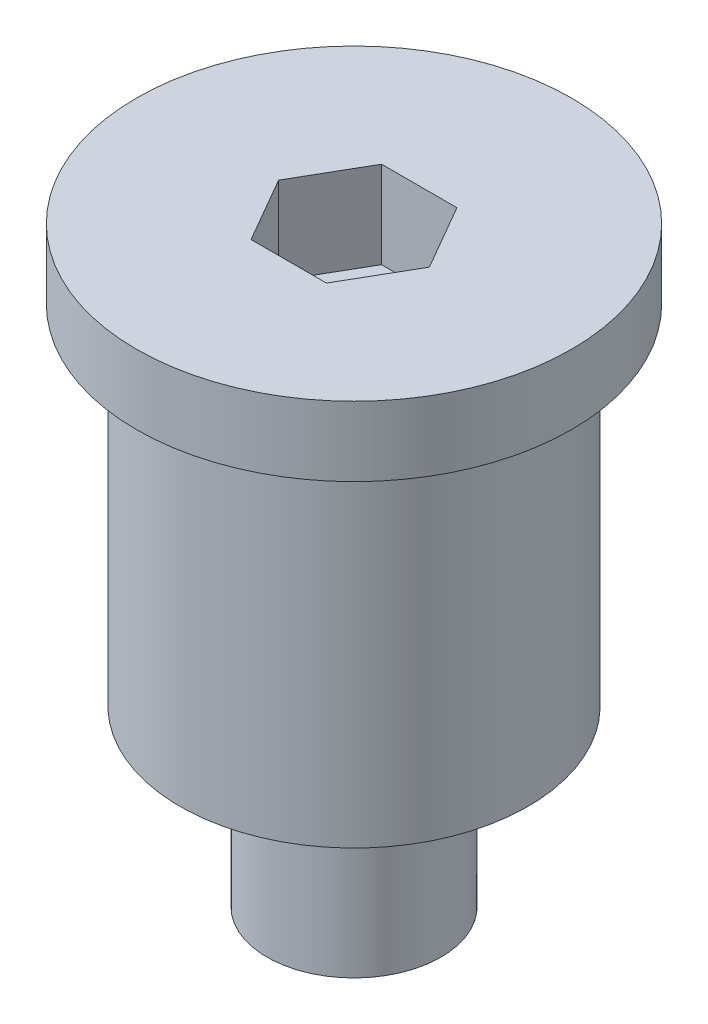
ISO-10303-21;
HEADER;
FILE_DESCRIPTION(('STEP AP214'),'2;1');
FILE_NAME('part.step','',(''),(''),'','','');
FILE_SCHEMA(('AUTOMOTIVE_DESIGN { 1 0 10303 214 1 1 1 1 }'));
ENDSEC;
DATA;
#1=APPLICATION_CONTEXT('core data for automotive mechanical design processes');
#2=APPLICATION_PROTOCOL_DEFINITION('international standard','automotive_design',2000,#1);
#3=PRODUCT_CONTEXT('',#1,'mechanical');
#4=PRODUCT('Part','Part','',(#3));
#5=PRODUCT_RELATED_PRODUCT_CATEGORY('part','',(#4));
#6=PRODUCT_DEFINITION_FORMATION('','',#4);
#7=PRODUCT_DEFINITION_CONTEXT('part definition',#1,'design');
#8=PRODUCT_DEFINITION('design','',#6,#7);
#9=PRODUCT_DEFINITION_SHAPE('','',#8);
#10=(LENGTH_UNIT() NAMED_UNIT(*) SI_UNIT(.MILLI.,.METRE.));
#11=(NAMED_UNIT(*) PLANE_ANGLE_UNIT() SI_UNIT($,.RADIAN.));
#12=(NAMED_UNIT(*) SI_UNIT($,.STERADIAN.) SOLID_ANGLE_UNIT());
#13=UNCERTAINTY_MEASURE_WITH_UNIT(LENGTH_MEASURE(1.E-05),#10,'distance_accuracy_value','');
#14=(GEOMETRIC_REPRESENTATION_CONTEXT(3) GLOBAL_UNCERTAINTY_ASSIGNED_CONTEXT((#13)) GLOBAL_UNIT_ASSIGNED_CONTEXT((#10,
#11,#12)) REPRESENTATION_CONTEXT('',''));
#15=CARTESIAN_POINT('',(0.,0.,0.));
#16=DIRECTION('',(0.,0.,1.));
#17=DIRECTION('',(1.,0.,0.));
#18=AXIS2_PLACEMENT_3D('',#15,#16,#17);
#19=CARTESIAN_POINT('',(0.,0.,3.175));
#20=DIRECTION('',(0.,1.,0.));
#21=DIRECTION('',(0.,0.,1.));
#22=AXIS2_PLACEMENT_3D('',#19,#20,#21);
#23=PLANE('',#22);
#24=CARTESIAN_POINT('',(0.,0.,0.));
#25=DIRECTION('',(0.,-1.,0.));
#26=DIRECTION('',(0.,0.,-1.));
#27=AXIS2_PLACEMENT_3D('',#24,#25,#26);
#28=CIRCLE('',#27,3.175);
#29=CARTESIAN_POINT('',(0.,0.,-3.175));
#30=VERTEX_POINT('',#29);
#31=EDGE_CURVE('E136',#30,#30,#28,.T.);
#32=ORIENTED_EDGE('',*,*,#31,.T.);
#33=EDGE_LOOP('',(#32));
#34=FACE_BOUND('',#33,.T.);
#35=ADVANCED_FACE('F35',(#34),#23,.F.);
#36=CARTESIAN_POINT('',(0.,21.59,0.));
#37=DIRECTION('',(0.,-1.,0.));
#38=DIRECTION('',(0.,0.,-1.));
#39=AXIS2_PLACEMENT_3D('',#36,#37,#38);
#40=PLANE('',#39);
#41=DIRECTION('',(-0.5,0.,0.866025403784439));
#42=VECTOR('',#41,1.);
#43=CARTESIAN_POINT('',(-1.3748153285078,21.59,-2.38125));
#44=LINE('',#43,#42);
#45=CARTESIAN_POINT('',(-1.3748153285078,21.59,-2.38125));
#46=VERTEX_POINT('',#45);
#47=CARTESIAN_POINT('',(-2.74963065701559,21.59,0.));
#48=VERTEX_POINT('',#47);
#49=EDGE_CURVE('E123',#46,#48,#44,.T.);
#50=ORIENTED_EDGE('',*,*,#49,.F.);
#51=DIRECTION('',(-1.,0.,0.));
#52=VECTOR('',#51,1.);
#53=CARTESIAN_POINT('',(1.3748153285078,21.59,-2.38125));
#54=LINE('',#53,#52);
#55=CARTESIAN_POINT('',(1.3748153285078,21.59,-2.38125));
#56=VERTEX_POINT('',#55);
#57=EDGE_CURVE('E49',#56,#46,#54,.T.);
#58=ORIENTED_EDGE('',*,*,#57,.F.);
#59=DIRECTION('',(-0.5,0.,-0.866025403784439));
#60=VECTOR('',#59,1.);
#61=CARTESIAN_POINT('',(2.74963065701559,21.59,0.));
#62=LINE('',#61,#60);
#63=CARTESIAN_POINT('',(2.74963065701559,21.59,0.));
#64=VERTEX_POINT('',#63);
#65=EDGE_CURVE('E132',#64,#56,#62,.T.);
#66=ORIENTED_EDGE('',*,*,#65,.F.);
#67=DIRECTION('',(0.5,0.,-0.866025403784439));
#68=VECTOR('',#67,1.);
#69=CARTESIAN_POINT('',(1.3748153285078,21.59,2.38125));
#70=LINE('',#69,#68);
#71=CARTESIAN_POINT('',(1.3748153285078,21.59,2.38125));
#72=VERTEX_POINT('',#71);
#73=EDGE_CURVE('E130',#72,#64,#70,.T.);
#74=ORIENTED_EDGE('',*,*,#73,.F.);
#75=DIRECTION('',(1.,0.,0.));
#76=VECTOR('',#75,1.);
#77=CARTESIAN_POINT('',(-1.3748153285078,21.59,2.38125));
#78=LINE('',#77,#76);
#79=CARTESIAN_POINT('',(-1.3748153285078,21.59,2.38125));
#80=VERTEX_POINT('',#79);
#81=EDGE_CURVE('E97',#80,#72,#78,.T.);
#82=ORIENTED_EDGE('',*,*,#81,.F.);
#83=DIRECTION('',(0.5,0.,0.866025403784439));
#84=VECTOR('',#83,1.);
#85=CARTESIAN_POINT('',(-2.74963065701559,21.59,0.));
#86=LINE('',#85,#84);
#87=EDGE_CURVE('E126',#48,#80,#86,.T.);
#88=ORIENTED_EDGE('',*,*,#87,.F.);
#89=EDGE_LOOP('',(#50,#58,#66,#74,#82,#88));
#90=FACE_BOUND('',#89,.T.);
#91=CARTESIAN_POINT('',(0.,21.59,0.));
#92=DIRECTION('',(0.,-1.,0.));
#93=DIRECTION('',(0.,0.,-1.));
#94=AXIS2_PLACEMENT_3D('',#91,#92,#93);
#95=CIRCLE('',#94,7.9375);
#96=CARTESIAN_POINT('',(0.,21.59,-7.9375));
#97=VERTEX_POINT('',#96);
#98=EDGE_CURVE('E11',#97,#97,#95,.T.);
#99=ORIENTED_EDGE('',*,*,#98,.F.);
#100=EDGE_LOOP('',(#99));
#101=FACE_BOUND('',#100,.T.);
#102=ADVANCED_FACE('F160',(#90,#101),#40,.F.);
#103=CARTESIAN_POINT('',(0.,0.,0.));
#104=DIRECTION('',(0.,-1.,0.));
#105=DIRECTION('',(0.,0.,-1.));
#106=AXIS2_PLACEMENT_3D('',#103,#104,#105);
#107=CYLINDRICAL_SURFACE('',#106,7.9375);
#108=CARTESIAN_POINT('',(0.,19.05,0.));
#109=DIRECTION('',(0.,-1.,0.));
#110=DIRECTION('',(0.,0.,-1.));
#111=AXIS2_PLACEMENT_3D('',#108,#109,#110);
#112=CIRCLE('',#111,7.9375);
#113=CARTESIAN_POINT('',(0.,19.05,-7.9375));
#114=VERTEX_POINT('',#113);
#115=EDGE_CURVE('E42',#114,#114,#112,.T.);
#116=ORIENTED_EDGE('',*,*,#115,.F.);
#117=EDGE_LOOP('',(#116));
#118=FACE_BOUND('',#117,.T.);
#119=ORIENTED_EDGE('',*,*,#98,.T.);
#120=EDGE_LOOP('',(#119));
#121=FACE_BOUND('',#120,.T.);
#122=ADVANCED_FACE('F157',(#118,#121),#107,.T.);
#123=CARTESIAN_POINT('',(0.,19.05,7.9375));
#124=DIRECTION('',(0.,1.,0.));
#125=DIRECTION('',(0.,0.,1.));
#126=AXIS2_PLACEMENT_3D('',#123,#124,#125);
#127=PLANE('',#126);
#128=CARTESIAN_POINT('',(0.,19.05,0.));
#129=DIRECTION('',(0.,-1.,0.));
#130=DIRECTION('',(0.,0.,-1.));
#131=AXIS2_PLACEMENT_3D('',#128,#129,#130);
#132=CIRCLE('',#131,6.35);
#133=CARTESIAN_POINT('',(0.,19.05,-6.35));
#134=VERTEX_POINT('',#133);
#135=EDGE_CURVE('E150',#134,#134,#132,.T.);
#136=ORIENTED_EDGE('',*,*,#135,.F.);
#137=EDGE_LOOP('',(#136));
#138=FACE_BOUND('',#137,.T.);
#139=ORIENTED_EDGE('',*,*,#115,.T.);
#140=EDGE_LOOP('',(#139));
#141=FACE_BOUND('',#140,.T.);
#142=ADVANCED_FACE('F155',(#138,#141),#127,.F.);
#143=CARTESIAN_POINT('',(0.,0.,0.));
#144=DIRECTION('',(0.,-1.,0.));
#145=DIRECTION('',(0.,0.,-1.));
#146=AXIS2_PLACEMENT_3D('',#143,#144,#145);
#147=CYLINDRICAL_SURFACE('',#146,6.35);
#148=CARTESIAN_POINT('',(0.,6.35,0.));
#149=DIRECTION('',(0.,-1.,0.));
#150=DIRECTION('',(0.,0.,-1.));
#151=AXIS2_PLACEMENT_3D('',#148,#149,#150);
#152=CIRCLE('',#151,6.35);
#153=CARTESIAN_POINT('',(0.,6.35,-6.35));
#154=VERTEX_POINT('',#153);
#155=EDGE_CURVE('E147',#154,#154,#152,.T.);
#156=ORIENTED_EDGE('',*,*,#155,.F.);
#157=EDGE_LOOP('',(#156));
#158=FACE_BOUND('',#157,.T.);
#159=ORIENTED_EDGE('',*,*,#135,.T.);
#160=EDGE_LOOP('',(#159));
#161=FACE_BOUND('',#160,.T.);
#162=ADVANCED_FACE('F174',(#158,#161),#147,.T.);
#163=CARTESIAN_POINT('',(0.,6.35,6.35));
#164=DIRECTION('',(0.,1.,0.));
#165=DIRECTION('',(0.,0.,1.));
#166=AXIS2_PLACEMENT_3D('',#163,#164,#165);
#167=PLANE('',#166);
#168=CARTESIAN_POINT('',(0.,6.35,0.));
#169=DIRECTION('',(0.,-1.,0.));
#170=DIRECTION('',(0.,0.,-1.));
#171=AXIS2_PLACEMENT_3D('',#168,#169,#170);
#172=CIRCLE('',#171,3.175);
#173=CARTESIAN_POINT('',(0.,6.35,-3.175));
#174=VERTEX_POINT('',#173);
#175=EDGE_CURVE('E144',#174,#174,#172,.T.);
#176=ORIENTED_EDGE('',*,*,#175,.F.);
#177=EDGE_LOOP('',(#176));
#178=FACE_BOUND('',#177,.T.);
#179=ORIENTED_EDGE('',*,*,#155,.T.);
#180=EDGE_LOOP('',(#179));
#181=FACE_BOUND('',#180,.T.);
#182=ADVANCED_FACE('F178',(#178,#181),#167,.F.);
#183=CARTESIAN_POINT('',(0.,0.,0.));
#184=DIRECTION('',(0.,-1.,0.));
#185=DIRECTION('',(0.,0.,-1.));
#186=AXIS2_PLACEMENT_3D('',#183,#184,#185);
#187=CYLINDRICAL_SURFACE('',#186,3.175);
#188=ORIENTED_EDGE('',*,*,#31,.F.);
#189=EDGE_LOOP('',(#188));
#190=FACE_BOUND('',#189,.T.);
#191=ORIENTED_EDGE('',*,*,#175,.T.);
#192=EDGE_LOOP('',(#191));
#193=FACE_BOUND('',#192,.T.);
#194=ADVANCED_FACE('F182',(#190,#193),#187,.T.);
#195=CARTESIAN_POINT('',(1.3748153285078,18.415,-2.38125));
#196=DIRECTION('',(0.,0.,-1.));
#197=DIRECTION('',(-1.,0.,0.));
#198=AXIS2_PLACEMENT_3D('',#195,#196,#197);
#199=PLANE('',#198);
#200=ORIENTED_EDGE('',*,*,#57,.T.);
#201=DIRECTION('',(0.,1.,0.));
#202=VECTOR('',#201,1.);
#203=CARTESIAN_POINT('',(-1.3748153285078,18.415,-2.38125));
#204=LINE('',#203,#202);
#205=CARTESIAN_POINT('',(-1.3748153285078,18.415,-2.38125));
#206=VERTEX_POINT('',#205);
#207=EDGE_CURVE('E79',#206,#46,#204,.T.);
#208=ORIENTED_EDGE('',*,*,#207,.F.);
#209=DIRECTION('',(-1.,0.,0.));
#210=VECTOR('',#209,1.);
#211=CARTESIAN_POINT('',(1.3748153285078,18.415,-2.38125));
#212=LINE('',#211,#210);
#213=CARTESIAN_POINT('',(1.3748153285078,18.415,-2.38125));
#214=VERTEX_POINT('',#213);
#215=EDGE_CURVE('E134',#214,#206,#212,.T.);
#216=ORIENTED_EDGE('',*,*,#215,.F.);
#217=DIRECTION('',(0.,1.,0.));
#218=VECTOR('',#217,1.);
#219=CARTESIAN_POINT('',(1.3748153285078,18.415,-2.38125));
#220=LINE('',#219,#218);
#221=EDGE_CURVE('E57',#214,#56,#220,.T.);
#222=ORIENTED_EDGE('',*,*,#221,.T.);
#223=EDGE_LOOP('',(#200,#208,#216,#222));
#224=FACE_BOUND('',#223,.T.);
#225=ADVANCED_FACE('F186',(#224),#199,.F.);
#226=CARTESIAN_POINT('',(2.74963065701559,18.415,0.));
#227=DIRECTION('',(0.866025403784439,0.,-0.5));
#228=DIRECTION('',(-0.5,0.,-0.866025403784439));
#229=AXIS2_PLACEMENT_3D('',#226,#227,#228);
#230=PLANE('',#229);
#231=ORIENTED_EDGE('',*,*,#65,.T.);
#232=ORIENTED_EDGE('',*,*,#221,.F.);
#233=DIRECTION('',(-0.5,0.,-0.866025403784439));
#234=VECTOR('',#233,1.);
#235=CARTESIAN_POINT('',(2.74963065701559,18.415,0.));
#236=LINE('',#235,#234);
#237=CARTESIAN_POINT('',(2.74963065701559,18.415,0.));
#238=VERTEX_POINT('',#237);
#239=EDGE_CURVE('E109',#238,#214,#236,.T.);
#240=ORIENTED_EDGE('',*,*,#239,.F.);
#241=DIRECTION('',(0.,1.,0.));
#242=VECTOR('',#241,1.);
#243=CARTESIAN_POINT('',(2.74963065701559,18.415,0.));
#244=LINE('',#243,#242);
#245=EDGE_CURVE('E101',#238,#64,#244,.T.);
#246=ORIENTED_EDGE('',*,*,#245,.T.);
#247=EDGE_LOOP('',(#231,#232,#240,#246));
#248=FACE_BOUND('',#247,.T.);
#249=ADVANCED_FACE('F190',(#248),#230,.F.);
#250=CARTESIAN_POINT('',(1.3748153285078,18.415,2.38125));
#251=DIRECTION('',(0.866025403784438,0.,0.5));
#252=DIRECTION('',(0.5,0.,-0.866025403784439));
#253=AXIS2_PLACEMENT_3D('',#250,#251,#252);
#254=PLANE('',#253);
#255=ORIENTED_EDGE('',*,*,#73,.T.);
#256=ORIENTED_EDGE('',*,*,#245,.F.);
#257=DIRECTION('',(0.5,0.,-0.866025403784439));
#258=VECTOR('',#257,1.);
#259=CARTESIAN_POINT('',(1.3748153285078,18.415,2.38125));
#260=LINE('',#259,#258);
#261=CARTESIAN_POINT('',(1.3748153285078,18.415,2.38125));
#262=VERTEX_POINT('',#261);
#263=EDGE_CURVE('E105',#262,#238,#260,.T.);
#264=ORIENTED_EDGE('',*,*,#263,.F.);
#265=DIRECTION('',(0.,1.,0.));
#266=VECTOR('',#265,1.);
#267=CARTESIAN_POINT('',(1.3748153285078,18.415,2.38125));
#268=LINE('',#267,#266);
#269=EDGE_CURVE('E90',#262,#72,#268,.T.);
#270=ORIENTED_EDGE('',*,*,#269,.T.);
#271=EDGE_LOOP('',(#255,#256,#264,#270));
#272=FACE_BOUND('',#271,.T.);
#273=ADVANCED_FACE('F106',(#272),#254,.F.);
#274=CARTESIAN_POINT('',(-1.3748153285078,18.415,2.38125));
#275=DIRECTION('',(0.,0.,1.));
#276=DIRECTION('',(1.,0.,0.));
#277=AXIS2_PLACEMENT_3D('',#274,#275,#276);
#278=PLANE('',#277);
#279=ORIENTED_EDGE('',*,*,#81,.T.);
#280=ORIENTED_EDGE('',*,*,#269,.F.);
#281=DIRECTION('',(1.,0.,0.));
#282=VECTOR('',#281,1.);
#283=CARTESIAN_POINT('',(-1.3748153285078,18.415,2.38125));
#284=LINE('',#283,#282);
#285=CARTESIAN_POINT('',(-1.3748153285078,18.415,2.38125));
#286=VERTEX_POINT('',#285);
#287=EDGE_CURVE('E94',#286,#262,#284,.T.);
#288=ORIENTED_EDGE('',*,*,#287,.F.);
#289=DIRECTION('',(0.,1.,0.));
#290=VECTOR('',#289,1.);
#291=CARTESIAN_POINT('',(-1.3748153285078,18.415,2.38125));
#292=LINE('',#291,#290);
#293=EDGE_CURVE('E102',#286,#80,#292,.T.);
#294=ORIENTED_EDGE('',*,*,#293,.T.);
#295=EDGE_LOOP('',(#279,#280,#288,#294));
#296=FACE_BOUND('',#295,.T.);
#297=ADVANCED_FACE('F92',(#296),#278,.F.);
#298=CARTESIAN_POINT('',(-2.74963065701559,18.415,0.));
#299=DIRECTION('',(-0.866025403784439,0.,0.5));
#300=DIRECTION('',(0.5,0.,0.866025403784439));
#301=AXIS2_PLACEMENT_3D('',#298,#299,#300);
#302=PLANE('',#301);
#303=ORIENTED_EDGE('',*,*,#87,.T.);
#304=ORIENTED_EDGE('',*,*,#293,.F.);
#305=DIRECTION('',(0.5,0.,0.866025403784439));
#306=VECTOR('',#305,1.);
#307=CARTESIAN_POINT('',(-2.74963065701559,18.415,0.));
#308=LINE('',#307,#306);
#309=CARTESIAN_POINT('',(-2.74963065701559,18.415,0.));
#310=VERTEX_POINT('',#309);
#311=EDGE_CURVE('E115',#310,#286,#308,.T.);
#312=ORIENTED_EDGE('',*,*,#311,.F.);
#313=DIRECTION('',(0.,1.,0.));
#314=VECTOR('',#313,1.);
#315=CARTESIAN_POINT('',(-2.74963065701559,18.415,0.));
#316=LINE('',#315,#314);
#317=EDGE_CURVE('E139',#310,#48,#316,.T.);
#318=ORIENTED_EDGE('',*,*,#317,.T.);
#319=EDGE_LOOP('',(#303,#304,#312,#318));
#320=FACE_BOUND('',#319,.T.);
#321=ADVANCED_FACE('F194',(#320),#302,.F.);
#322=CARTESIAN_POINT('',(-1.3748153285078,18.415,-2.38125));
#323=DIRECTION('',(-0.866025403784438,0.,-0.5));
#324=DIRECTION('',(-0.5,0.,0.866025403784439));
#325=AXIS2_PLACEMENT_3D('',#322,#323,#324);
#326=PLANE('',#325);
#327=ORIENTED_EDGE('',*,*,#49,.T.);
#328=ORIENTED_EDGE('',*,*,#317,.F.);
#329=DIRECTION('',(-0.5,0.,0.866025403784439));
#330=VECTOR('',#329,1.);
#331=CARTESIAN_POINT('',(-1.3748153285078,18.415,-2.38125));
#332=LINE('',#331,#330);
#333=EDGE_CURVE('E117',#206,#310,#332,.T.);
#334=ORIENTED_EDGE('',*,*,#333,.F.);
#335=ORIENTED_EDGE('',*,*,#207,.T.);
#336=EDGE_LOOP('',(#327,#328,#334,#335));
#337=FACE_BOUND('',#336,.T.);
#338=ADVANCED_FACE('F191',(#337),#326,.F.);
#339=CARTESIAN_POINT('',(0.,18.415,0.));
#340=DIRECTION('',(0.,1.,0.));
#341=DIRECTION('',(0.,0.,1.));
#342=AXIS2_PLACEMENT_3D('',#339,#340,#341);
#343=PLANE('',#342);
#344=ORIENTED_EDGE('',*,*,#215,.T.);
#345=ORIENTED_EDGE('',*,*,#333,.T.);
#346=ORIENTED_EDGE('',*,*,#311,.T.);
#347=ORIENTED_EDGE('',*,*,#287,.T.);
#348=ORIENTED_EDGE('',*,*,#263,.T.);
#349=ORIENTED_EDGE('',*,*,#239,.T.);
#350=EDGE_LOOP('',(#344,#345,#346,#347,#348,#349));
#351=FACE_BOUND('',#350,.T.);
#352=ADVANCED_FACE('F112',(#351),#343,.T.);
#353=CLOSED_SHELL('',(#35,#102,#122,#142,#162,#182,#194,#225,#249,#273,#297,#321,#338,#352));
#354=MANIFOLD_SOLID_BREP('B2',#353);
#355=ADVANCED_BREP_SHAPE_REPRESENTATION('',(#18,#354),#14);
#356=SHAPE_DEFINITION_REPRESENTATION(#9,#355);
ENDSEC;
END-ISO-10303-21;
